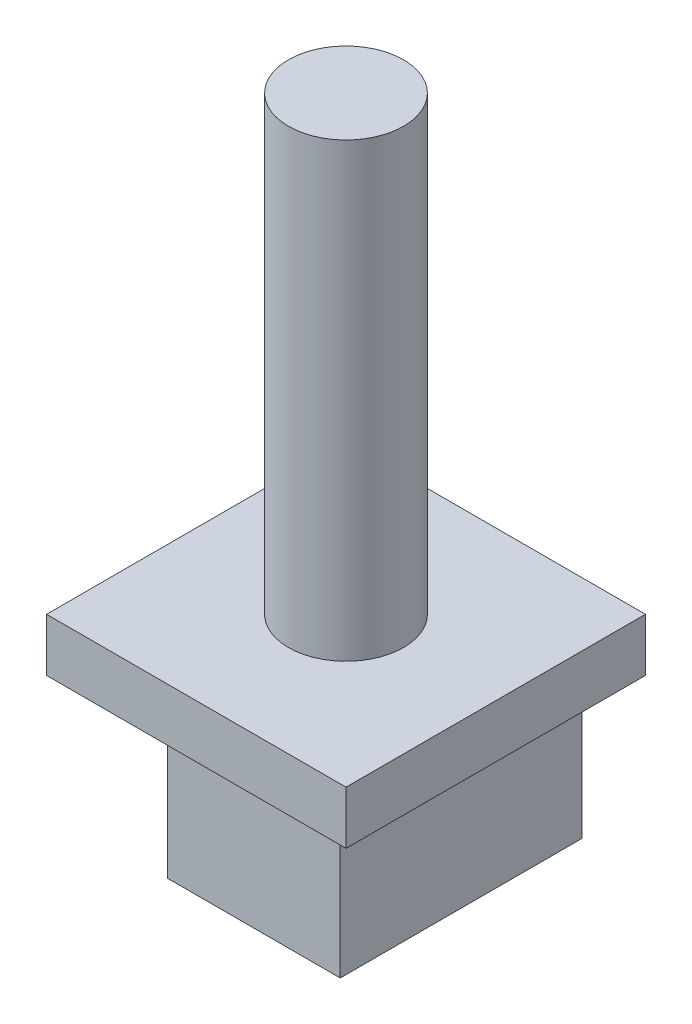
ISO-10303-21;
HEADER;
FILE_DESCRIPTION(('STEP AP214'),'2;1');
FILE_NAME('part.step','',(''),(''),'','','');
FILE_SCHEMA(('AUTOMOTIVE_DESIGN { 1 0 10303 214 1 1 1 1 }'));
ENDSEC;
DATA;
#1=APPLICATION_CONTEXT('core data for automotive mechanical design processes');
#2=APPLICATION_PROTOCOL_DEFINITION('international standard','automotive_design',2000,#1);
#3=PRODUCT_CONTEXT('',#1,'mechanical');
#4=PRODUCT('Part','Part','',(#3));
#5=PRODUCT_RELATED_PRODUCT_CATEGORY('part','',(#4));
#6=PRODUCT_DEFINITION_FORMATION('','',#4);
#7=PRODUCT_DEFINITION_CONTEXT('part definition',#1,'design');
#8=PRODUCT_DEFINITION('design','',#6,#7);
#9=PRODUCT_DEFINITION_SHAPE('','',#8);
#10=(LENGTH_UNIT() NAMED_UNIT(*) SI_UNIT(.MILLI.,.METRE.));
#11=(NAMED_UNIT(*) PLANE_ANGLE_UNIT() SI_UNIT($,.RADIAN.));
#12=(NAMED_UNIT(*) SI_UNIT($,.STERADIAN.) SOLID_ANGLE_UNIT());
#13=UNCERTAINTY_MEASURE_WITH_UNIT(LENGTH_MEASURE(1.E-05),#10,'distance_accuracy_value','');
#14=(GEOMETRIC_REPRESENTATION_CONTEXT(3) GLOBAL_UNCERTAINTY_ASSIGNED_CONTEXT((#13)) GLOBAL_UNIT_ASSIGNED_CONTEXT((#10,
#11,#12)) REPRESENTATION_CONTEXT('',''));
#15=CARTESIAN_POINT('',(0.,0.,0.));
#16=DIRECTION('',(0.,0.,1.));
#17=DIRECTION('',(1.,0.,0.));
#18=AXIS2_PLACEMENT_3D('',#15,#16,#17);
#19=CARTESIAN_POINT('',(0.,49.784,0.));
#20=DIRECTION('',(0.,-1.,0.));
#21=DIRECTION('',(0.,0.,-1.));
#22=AXIS2_PLACEMENT_3D('',#19,#20,#21);
#23=CYLINDRICAL_SURFACE('',#22,6.35);
#24=CARTESIAN_POINT('',(0.,49.784,0.));
#25=DIRECTION('',(0.,1.,0.));
#26=DIRECTION('',(0.,0.,1.));
#27=AXIS2_PLACEMENT_3D('',#24,#25,#26);
#28=CIRCLE('',#27,6.35);
#29=CARTESIAN_POINT('',(0.,49.784,6.35));
#30=VERTEX_POINT('',#29);
#31=EDGE_CURVE('E11',#30,#30,#28,.T.);
#32=ORIENTED_EDGE('',*,*,#31,.F.);
#33=EDGE_LOOP('',(#32));
#34=FACE_BOUND('',#33,.T.);
#35=CARTESIAN_POINT('',(0.,0.,0.));
#36=DIRECTION('',(0.,1.,0.));
#37=DIRECTION('',(0.,0.,1.));
#38=AXIS2_PLACEMENT_3D('',#35,#36,#37);
#39=CIRCLE('',#38,6.35);
#40=CARTESIAN_POINT('',(0.,0.,6.35));
#41=VERTEX_POINT('',#40);
#42=EDGE_CURVE('E41',#41,#41,#39,.T.);
#43=ORIENTED_EDGE('',*,*,#42,.T.);
#44=EDGE_LOOP('',(#43));
#45=FACE_BOUND('',#44,.T.);
#46=ADVANCED_FACE('F33',(#34,#45),#23,.T.);
#47=CARTESIAN_POINT('',(0.,49.784,0.));
#48=DIRECTION('',(0.,1.,0.));
#49=DIRECTION('',(0.,0.,1.));
#50=AXIS2_PLACEMENT_3D('',#47,#48,#49);
#51=PLANE('',#50);
#52=ORIENTED_EDGE('',*,*,#31,.T.);
#53=EDGE_LOOP('',(#52));
#54=FACE_BOUND('',#53,.T.);
#55=ADVANCED_FACE('F209',(#54),#51,.T.);
#56=CARTESIAN_POINT('',(0.,0.,0.));
#57=DIRECTION('',(0.,1.,0.));
#58=DIRECTION('',(0.,0.,1.));
#59=AXIS2_PLACEMENT_3D('',#56,#57,#58);
#60=PLANE('',#59);
#61=DIRECTION('',(-1.,0.,0.));
#62=VECTOR('',#61,1.);
#63=CARTESIAN_POINT('',(16.51,0.,-16.51));
#64=LINE('',#63,#62);
#65=CARTESIAN_POINT('',(16.51,0.,-16.51));
#66=VERTEX_POINT('',#65);
#67=CARTESIAN_POINT('',(-16.51,0.,-16.51));
#68=VERTEX_POINT('',#67);
#69=EDGE_CURVE('E148',#66,#68,#64,.T.);
#70=ORIENTED_EDGE('',*,*,#69,.T.);
#71=DIRECTION('',(0.,0.,1.));
#72=VECTOR('',#71,1.);
#73=CARTESIAN_POINT('',(-16.51,0.,-16.51));
#74=LINE('',#73,#72);
#75=CARTESIAN_POINT('',(-16.51,0.,16.51));
#76=VERTEX_POINT('',#75);
#77=EDGE_CURVE('E162',#68,#76,#74,.T.);
#78=ORIENTED_EDGE('',*,*,#77,.T.);
#79=DIRECTION('',(-1.,0.,0.));
#80=VECTOR('',#79,1.);
#81=CARTESIAN_POINT('',(16.51,0.,16.51));
#82=LINE('',#81,#80);
#83=CARTESIAN_POINT('',(16.51,0.,16.51));
#84=VERTEX_POINT('',#83);
#85=EDGE_CURVE('E157',#84,#76,#82,.T.);
#86=ORIENTED_EDGE('',*,*,#85,.F.);
#87=DIRECTION('',(0.,0.,1.));
#88=VECTOR('',#87,1.);
#89=CARTESIAN_POINT('',(16.51,0.,-16.51));
#90=LINE('',#89,#88);
#91=EDGE_CURVE('E156',#66,#84,#90,.T.);
#92=ORIENTED_EDGE('',*,*,#91,.F.);
#93=EDGE_LOOP('',(#70,#78,#86,#92));
#94=FACE_BOUND('',#93,.T.);
#95=ORIENTED_EDGE('',*,*,#42,.F.);
#96=EDGE_LOOP('',(#95));
#97=FACE_BOUND('',#96,.T.);
#98=ADVANCED_FACE('F187',(#94,#97),#60,.T.);
#99=CARTESIAN_POINT('',(16.51,-5.842,-16.51));
#100=DIRECTION('',(0.,0.,-1.));
#101=DIRECTION('',(-1.,0.,0.));
#102=AXIS2_PLACEMENT_3D('',#99,#100,#101);
#103=PLANE('',#102);
#104=ORIENTED_EDGE('',*,*,#69,.F.);
#105=DIRECTION('',(0.,1.,0.));
#106=VECTOR('',#105,1.);
#107=CARTESIAN_POINT('',(16.51,-5.842,-16.51));
#108=LINE('',#107,#106);
#109=CARTESIAN_POINT('',(16.51,-5.842,-16.51));
#110=VERTEX_POINT('',#109);
#111=EDGE_CURVE('E58',#110,#66,#108,.T.);
#112=ORIENTED_EDGE('',*,*,#111,.F.);
#113=DIRECTION('',(-1.,0.,0.));
#114=VECTOR('',#113,1.);
#115=CARTESIAN_POINT('',(16.51,-5.842,-16.51));
#116=LINE('',#115,#114);
#117=CARTESIAN_POINT('',(9.525,-5.842,-16.51));
#118=VERTEX_POINT('',#117);
#119=EDGE_CURVE('E155',#110,#118,#116,.T.);
#120=ORIENTED_EDGE('',*,*,#119,.T.);
#121=DIRECTION('',(0.,1.,0.));
#122=VECTOR('',#121,1.);
#123=CARTESIAN_POINT('',(9.525,-24.892,-16.51));
#124=LINE('',#123,#122);
#125=CARTESIAN_POINT('',(9.525,-24.892,-16.51));
#126=VERTEX_POINT('',#125);
#127=EDGE_CURVE('E49',#126,#118,#124,.T.);
#128=ORIENTED_EDGE('',*,*,#127,.F.);
#129=DIRECTION('',(1.,0.,0.));
#130=VECTOR('',#129,1.);
#131=CARTESIAN_POINT('',(-9.525,-24.892,-16.51));
#132=LINE('',#131,#130);
#133=CARTESIAN_POINT('',(-9.525,-24.892,-16.51));
#134=VERTEX_POINT('',#133);
#135=EDGE_CURVE('E118',#134,#126,#132,.T.);
#136=ORIENTED_EDGE('',*,*,#135,.F.);
#137=DIRECTION('',(0.,1.,0.));
#138=VECTOR('',#137,1.);
#139=CARTESIAN_POINT('',(-9.525,-24.892,-16.51));
#140=LINE('',#139,#138);
#141=CARTESIAN_POINT('',(-9.525,-5.842,-16.51));
#142=VERTEX_POINT('',#141);
#143=EDGE_CURVE('E128',#134,#142,#140,.T.);
#144=ORIENTED_EDGE('',*,*,#143,.T.);
#145=CARTESIAN_POINT('',(-16.51,-5.842,-16.51));
#146=VERTEX_POINT('',#145);
#147=EDGE_CURVE('E82',#142,#146,#116,.T.);
#148=ORIENTED_EDGE('',*,*,#147,.T.);
#149=DIRECTION('',(0.,1.,0.));
#150=VECTOR('',#149,1.);
#151=CARTESIAN_POINT('',(-16.51,-5.842,-16.51));
#152=LINE('',#151,#150);
#153=EDGE_CURVE('E171',#146,#68,#152,.T.);
#154=ORIENTED_EDGE('',*,*,#153,.T.);
#155=EDGE_LOOP('',(#104,#112,#120,#128,#136,#144,#148,#154));
#156=FACE_BOUND('',#155,.T.);
#157=ADVANCED_FACE('F197',(#156),#103,.T.);
#158=CARTESIAN_POINT('',(16.51,-5.842,-16.51));
#159=DIRECTION('',(-1.,0.,0.));
#160=DIRECTION('',(0.,0.,1.));
#161=AXIS2_PLACEMENT_3D('',#158,#159,#160);
#162=PLANE('',#161);
#163=ORIENTED_EDGE('',*,*,#91,.T.);
#164=DIRECTION('',(0.,1.,0.));
#165=VECTOR('',#164,1.);
#166=CARTESIAN_POINT('',(16.51,-5.842,16.51));
#167=LINE('',#166,#165);
#168=CARTESIAN_POINT('',(16.51,-5.842,16.51));
#169=VERTEX_POINT('',#168);
#170=EDGE_CURVE('E167',#169,#84,#167,.T.);
#171=ORIENTED_EDGE('',*,*,#170,.F.);
#172=DIRECTION('',(0.,0.,1.));
#173=VECTOR('',#172,1.);
#174=CARTESIAN_POINT('',(16.51,-5.842,-16.51));
#175=LINE('',#174,#173);
#176=EDGE_CURVE('E173',#110,#169,#175,.T.);
#177=ORIENTED_EDGE('',*,*,#176,.F.);
#178=ORIENTED_EDGE('',*,*,#111,.T.);
#179=EDGE_LOOP('',(#163,#171,#177,#178));
#180=FACE_BOUND('',#179,.T.);
#181=ADVANCED_FACE('F195',(#180),#162,.F.);
#182=CARTESIAN_POINT('',(16.51,-5.842,16.51));
#183=DIRECTION('',(0.,0.,-1.));
#184=DIRECTION('',(-1.,0.,0.));
#185=AXIS2_PLACEMENT_3D('',#182,#183,#184);
#186=PLANE('',#185);
#187=ORIENTED_EDGE('',*,*,#85,.T.);
#188=DIRECTION('',(0.,1.,0.));
#189=VECTOR('',#188,1.);
#190=CARTESIAN_POINT('',(-16.51,-5.842,16.51));
#191=LINE('',#190,#189);
#192=CARTESIAN_POINT('',(-16.51,-5.842,16.51));
#193=VERTEX_POINT('',#192);
#194=EDGE_CURVE('E169',#193,#76,#191,.T.);
#195=ORIENTED_EDGE('',*,*,#194,.F.);
#196=DIRECTION('',(-1.,0.,0.));
#197=VECTOR('',#196,1.);
#198=CARTESIAN_POINT('',(16.51,-5.842,16.51));
#199=LINE('',#198,#197);
#200=EDGE_CURVE('E179',#169,#193,#199,.T.);
#201=ORIENTED_EDGE('',*,*,#200,.F.);
#202=ORIENTED_EDGE('',*,*,#170,.T.);
#203=EDGE_LOOP('',(#187,#195,#201,#202));
#204=FACE_BOUND('',#203,.T.);
#205=ADVANCED_FACE('F194',(#204),#186,.F.);
#206=CARTESIAN_POINT('',(-16.51,-5.842,-16.51));
#207=DIRECTION('',(-1.,0.,0.));
#208=DIRECTION('',(0.,0.,1.));
#209=AXIS2_PLACEMENT_3D('',#206,#207,#208);
#210=PLANE('',#209);
#211=ORIENTED_EDGE('',*,*,#77,.F.);
#212=ORIENTED_EDGE('',*,*,#153,.F.);
#213=DIRECTION('',(0.,0.,1.));
#214=VECTOR('',#213,1.);
#215=CARTESIAN_POINT('',(-16.51,-5.842,-16.51));
#216=LINE('',#215,#214);
#217=EDGE_CURVE('E154',#146,#193,#216,.T.);
#218=ORIENTED_EDGE('',*,*,#217,.T.);
#219=ORIENTED_EDGE('',*,*,#194,.T.);
#220=EDGE_LOOP('',(#211,#212,#218,#219));
#221=FACE_BOUND('',#220,.T.);
#222=ADVANCED_FACE('F190',(#221),#210,.T.);
#223=CARTESIAN_POINT('',(0.,-5.842,0.));
#224=DIRECTION('',(0.,1.,0.));
#225=DIRECTION('',(0.,0.,1.));
#226=AXIS2_PLACEMENT_3D('',#223,#224,#225);
#227=PLANE('',#226);
#228=ORIENTED_EDGE('',*,*,#147,.F.);
#229=DIRECTION('',(0.,0.,1.));
#230=VECTOR('',#229,1.);
#231=CARTESIAN_POINT('',(-9.525,-5.842,-16.51));
#232=LINE('',#231,#230);
#233=CARTESIAN_POINT('',(-9.525,-5.842,10.16));
#234=VERTEX_POINT('',#233);
#235=EDGE_CURVE('E137',#142,#234,#232,.T.);
#236=ORIENTED_EDGE('',*,*,#235,.T.);
#237=DIRECTION('',(1.,0.,0.));
#238=VECTOR('',#237,1.);
#239=CARTESIAN_POINT('',(-9.525,-5.842,10.16));
#240=LINE('',#239,#238);
#241=CARTESIAN_POINT('',(9.525,-5.842,10.16));
#242=VERTEX_POINT('',#241);
#243=EDGE_CURVE('E112',#234,#242,#240,.T.);
#244=ORIENTED_EDGE('',*,*,#243,.T.);
#245=DIRECTION('',(0.,0.,-1.));
#246=VECTOR('',#245,1.);
#247=CARTESIAN_POINT('',(9.525,-5.842,10.16));
#248=LINE('',#247,#246);
#249=EDGE_CURVE('E130',#242,#118,#248,.T.);
#250=ORIENTED_EDGE('',*,*,#249,.T.);
#251=ORIENTED_EDGE('',*,*,#119,.F.);
#252=ORIENTED_EDGE('',*,*,#176,.T.);
#253=ORIENTED_EDGE('',*,*,#200,.T.);
#254=ORIENTED_EDGE('',*,*,#217,.F.);
#255=EDGE_LOOP('',(#228,#236,#244,#250,#251,#252,#253,#254));
#256=FACE_BOUND('',#255,.T.);
#257=ADVANCED_FACE('F151',(#256),#227,.F.);
#258=CARTESIAN_POINT('',(-9.525,-24.892,-16.51));
#259=DIRECTION('',(-1.,0.,0.));
#260=DIRECTION('',(0.,0.,1.));
#261=AXIS2_PLACEMENT_3D('',#258,#259,#260);
#262=PLANE('',#261);
#263=ORIENTED_EDGE('',*,*,#235,.F.);
#264=ORIENTED_EDGE('',*,*,#143,.F.);
#265=DIRECTION('',(0.,0.,1.));
#266=VECTOR('',#265,1.);
#267=CARTESIAN_POINT('',(-9.525,-24.892,-16.51));
#268=LINE('',#267,#266);
#269=CARTESIAN_POINT('',(-9.525,-24.892,10.16));
#270=VERTEX_POINT('',#269);
#271=EDGE_CURVE('E124',#134,#270,#268,.T.);
#272=ORIENTED_EDGE('',*,*,#271,.T.);
#273=DIRECTION('',(0.,1.,0.));
#274=VECTOR('',#273,1.);
#275=CARTESIAN_POINT('',(-9.525,-24.892,10.16));
#276=LINE('',#275,#274);
#277=EDGE_CURVE('E107',#270,#234,#276,.T.);
#278=ORIENTED_EDGE('',*,*,#277,.T.);
#279=EDGE_LOOP('',(#263,#264,#272,#278));
#280=FACE_BOUND('',#279,.T.);
#281=ADVANCED_FACE('F127',(#280),#262,.T.);
#282=CARTESIAN_POINT('',(9.525,-24.892,10.16));
#283=DIRECTION('',(1.,0.,0.));
#284=DIRECTION('',(0.,0.,-1.));
#285=AXIS2_PLACEMENT_3D('',#282,#283,#284);
#286=PLANE('',#285);
#287=ORIENTED_EDGE('',*,*,#249,.F.);
#288=DIRECTION('',(0.,1.,0.));
#289=VECTOR('',#288,1.);
#290=CARTESIAN_POINT('',(9.525,-24.892,10.16));
#291=LINE('',#290,#289);
#292=CARTESIAN_POINT('',(9.525,-24.892,10.16));
#293=VERTEX_POINT('',#292);
#294=EDGE_CURVE('E117',#293,#242,#291,.T.);
#295=ORIENTED_EDGE('',*,*,#294,.F.);
#296=DIRECTION('',(0.,0.,-1.));
#297=VECTOR('',#296,1.);
#298=CARTESIAN_POINT('',(9.525,-24.892,10.16));
#299=LINE('',#298,#297);
#300=EDGE_CURVE('E125',#293,#126,#299,.T.);
#301=ORIENTED_EDGE('',*,*,#300,.T.);
#302=ORIENTED_EDGE('',*,*,#127,.T.);
#303=EDGE_LOOP('',(#287,#295,#301,#302));
#304=FACE_BOUND('',#303,.T.);
#305=ADVANCED_FACE('F198',(#304),#286,.T.);
#306=CARTESIAN_POINT('',(-9.525,-24.892,10.16));
#307=DIRECTION('',(0.,0.,1.));
#308=DIRECTION('',(1.,0.,0.));
#309=AXIS2_PLACEMENT_3D('',#306,#307,#308);
#310=PLANE('',#309);
#311=ORIENTED_EDGE('',*,*,#243,.F.);
#312=ORIENTED_EDGE('',*,*,#277,.F.);
#313=DIRECTION('',(1.,0.,0.));
#314=VECTOR('',#313,1.);
#315=CARTESIAN_POINT('',(-9.525,-24.892,10.16));
#316=LINE('',#315,#314);
#317=EDGE_CURVE('E110',#270,#293,#316,.T.);
#318=ORIENTED_EDGE('',*,*,#317,.T.);
#319=ORIENTED_EDGE('',*,*,#294,.T.);
#320=EDGE_LOOP('',(#311,#312,#318,#319));
#321=FACE_BOUND('',#320,.T.);
#322=ADVANCED_FACE('F109',(#321),#310,.T.);
#323=CARTESIAN_POINT('',(0.,-24.892,0.));
#324=DIRECTION('',(0.,1.,0.));
#325=DIRECTION('',(0.,0.,1.));
#326=AXIS2_PLACEMENT_3D('',#323,#324,#325);
#327=PLANE('',#326);
#328=ORIENTED_EDGE('',*,*,#271,.F.);
#329=ORIENTED_EDGE('',*,*,#135,.T.);
#330=ORIENTED_EDGE('',*,*,#300,.F.);
#331=ORIENTED_EDGE('',*,*,#317,.F.);
#332=EDGE_LOOP('',(#328,#329,#330,#331));
#333=FACE_BOUND('',#332,.T.);
#334=ADVANCED_FACE('F123',(#333),#327,.F.);
#335=CLOSED_SHELL('',(#46,#55,#98,#157,#181,#205,#222,#257,#281,#305,#322,#334));
#336=MANIFOLD_SOLID_BREP('B2',#335);
#337=ADVANCED_BREP_SHAPE_REPRESENTATION('',(#18,#336),#14);
#338=SHAPE_DEFINITION_REPRESENTATION(#9,#337);
ENDSEC;
END-ISO-10303-21;
